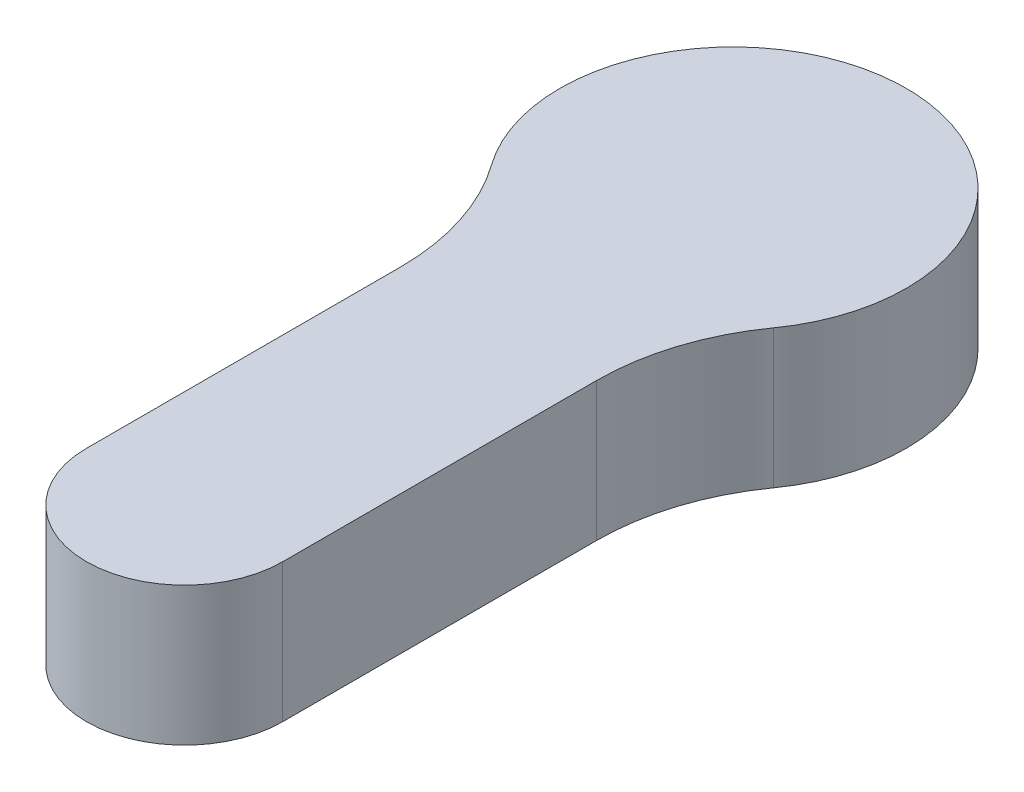
ISO-10303-21;
HEADER;
FILE_DESCRIPTION(('STEP AP214'),'2;1');
FILE_NAME('part.step','',(''),(''),'','','');
FILE_SCHEMA(('AUTOMOTIVE_DESIGN { 1 0 10303 214 1 1 1 1 }'));
ENDSEC;
DATA;
#1=APPLICATION_CONTEXT('core data for automotive mechanical design processes');
#2=APPLICATION_PROTOCOL_DEFINITION('international standard','automotive_design',2000,#1);
#3=PRODUCT_CONTEXT('',#1,'mechanical');
#4=PRODUCT('Part','Part','',(#3));
#5=PRODUCT_RELATED_PRODUCT_CATEGORY('part','',(#4));
#6=PRODUCT_DEFINITION_FORMATION('','',#4);
#7=PRODUCT_DEFINITION_CONTEXT('part definition',#1,'design');
#8=PRODUCT_DEFINITION('design','',#6,#7);
#9=PRODUCT_DEFINITION_SHAPE('','',#8);
#10=(LENGTH_UNIT() NAMED_UNIT(*) SI_UNIT(.MILLI.,.METRE.));
#11=(NAMED_UNIT(*) PLANE_ANGLE_UNIT() SI_UNIT($,.RADIAN.));
#12=(NAMED_UNIT(*) SI_UNIT($,.STERADIAN.) SOLID_ANGLE_UNIT());
#13=UNCERTAINTY_MEASURE_WITH_UNIT(LENGTH_MEASURE(1.E-05),#10,'distance_accuracy_value','');
#14=(GEOMETRIC_REPRESENTATION_CONTEXT(3) GLOBAL_UNCERTAINTY_ASSIGNED_CONTEXT((#13)) GLOBAL_UNIT_ASSIGNED_CONTEXT((#10,
#11,#12)) REPRESENTATION_CONTEXT('',''));
#15=CARTESIAN_POINT('',(0.,0.,0.));
#16=DIRECTION('',(0.,0.,1.));
#17=DIRECTION('',(1.,0.,0.));
#18=AXIS2_PLACEMENT_3D('',#15,#16,#17);
#19=CARTESIAN_POINT('',(0.,6.,0.));
#20=DIRECTION('',(0.,-1.,0.));
#21=DIRECTION('',(0.,0.,-1.));
#22=AXIS2_PLACEMENT_3D('',#19,#20,#21);
#23=CYLINDRICAL_SURFACE('',#22,7.5);
#24=CARTESIAN_POINT('',(0.,0.,0.));
#25=DIRECTION('',(0.,1.,0.));
#26=DIRECTION('',(0.,0.,1.));
#27=AXIS2_PLACEMENT_3D('',#24,#25,#26);
#28=CIRCLE('',#27,7.5);
#29=CARTESIAN_POINT('',(6.10714285714286,0.,4.35348206869501));
#30=VERTEX_POINT('',#29);
#31=CARTESIAN_POINT('',(-6.10714285714286,0.,4.35348206869501));
#32=VERTEX_POINT('',#31);
#33=EDGE_CURVE('E117',#30,#32,#28,.T.);
#34=ORIENTED_EDGE('',*,*,#33,.T.);
#35=DIRECTION('',(0.,-1.,0.));
#36=VECTOR('',#35,1.);
#37=CARTESIAN_POINT('',(-6.10714285714286,6.,4.35348206869501));
#38=LINE('',#37,#36);
#39=CARTESIAN_POINT('',(-6.10714285714286,6.,4.35348206869501));
#40=VERTEX_POINT('',#39);
#41=EDGE_CURVE('E130',#32,#40,#38,.F.);
#42=ORIENTED_EDGE('',*,*,#41,.T.);
#43=CARTESIAN_POINT('',(0.,6.,0.));
#44=DIRECTION('',(0.,1.,0.));
#45=DIRECTION('',(0.,0.,1.));
#46=AXIS2_PLACEMENT_3D('',#43,#44,#45);
#47=CIRCLE('',#46,7.5);
#48=CARTESIAN_POINT('',(6.10714285714286,6.,4.35348206869501));
#49=VERTEX_POINT('',#48);
#50=EDGE_CURVE('E97',#49,#40,#47,.T.);
#51=ORIENTED_EDGE('',*,*,#50,.F.);
#52=DIRECTION('',(0.,-1.,0.));
#53=VECTOR('',#52,1.);
#54=CARTESIAN_POINT('',(6.10714285714286,6.,4.35348206869501));
#55=LINE('',#54,#53);
#56=EDGE_CURVE('E127',#49,#30,#55,.T.);
#57=ORIENTED_EDGE('',*,*,#56,.T.);
#58=EDGE_LOOP('',(#34,#42,#51,#57));
#59=FACE_BOUND('',#58,.T.);
#60=ADVANCED_FACE('F34',(#59),#23,.T.);
#61=CARTESIAN_POINT('',(-4.25,6.,0.));
#62=DIRECTION('',(1.,0.,0.));
#63=DIRECTION('',(0.,0.,-1.));
#64=AXIS2_PLACEMENT_3D('',#61,#62,#63);
#65=PLANE('',#64);
#66=DIRECTION('',(0.,0.,1.));
#67=VECTOR('',#66,1.);
#68=CARTESIAN_POINT('',(-4.25,6.,0.));
#69=LINE('',#68,#67);
#70=CARTESIAN_POINT('',(-4.25,6.,10.158124826955));
#71=VERTEX_POINT('',#70);
#72=CARTESIAN_POINT('',(-4.25,6.,23.75));
#73=VERTEX_POINT('',#72);
#74=EDGE_CURVE('E85',#71,#73,#69,.T.);
#75=ORIENTED_EDGE('',*,*,#74,.F.);
#76=DIRECTION('',(0.,1.,0.));
#77=VECTOR('',#76,1.);
#78=CARTESIAN_POINT('',(-4.25,0.,10.158124826955));
#79=LINE('',#78,#77);
#80=CARTESIAN_POINT('',(-4.25,0.,10.158124826955));
#81=VERTEX_POINT('',#80);
#82=EDGE_CURVE('E107',#71,#81,#79,.F.);
#83=ORIENTED_EDGE('',*,*,#82,.T.);
#84=DIRECTION('',(0.,0.,1.));
#85=VECTOR('',#84,1.);
#86=CARTESIAN_POINT('',(-4.25,0.,0.));
#87=LINE('',#86,#85);
#88=CARTESIAN_POINT('',(-4.25,0.,23.75));
#89=VERTEX_POINT('',#88);
#90=EDGE_CURVE('E103',#81,#89,#87,.T.);
#91=ORIENTED_EDGE('',*,*,#90,.T.);
#92=DIRECTION('',(0.,-1.,0.));
#93=VECTOR('',#92,1.);
#94=CARTESIAN_POINT('',(-4.25,6.,23.75));
#95=LINE('',#94,#93);
#96=EDGE_CURVE('E100',#73,#89,#95,.T.);
#97=ORIENTED_EDGE('',*,*,#96,.F.);
#98=EDGE_LOOP('',(#75,#83,#91,#97));
#99=FACE_BOUND('',#98,.T.);
#100=ADVANCED_FACE('F101',(#99),#65,.F.);
#101=CARTESIAN_POINT('',(0.,6.,23.75));
#102=DIRECTION('',(0.,-1.,0.));
#103=DIRECTION('',(0.,0.,-1.));
#104=AXIS2_PLACEMENT_3D('',#101,#102,#103);
#105=CYLINDRICAL_SURFACE('',#104,4.25);
#106=CARTESIAN_POINT('',(0.,0.,23.75));
#107=DIRECTION('',(0.,1.,0.));
#108=DIRECTION('',(0.,0.,1.));
#109=AXIS2_PLACEMENT_3D('',#106,#107,#108);
#110=CIRCLE('',#109,4.25);
#111=CARTESIAN_POINT('',(4.25,0.,23.75));
#112=VERTEX_POINT('',#111);
#113=EDGE_CURVE('E121',#89,#112,#110,.T.);
#114=ORIENTED_EDGE('',*,*,#113,.T.);
#115=DIRECTION('',(0.,-1.,0.));
#116=VECTOR('',#115,1.);
#117=CARTESIAN_POINT('',(4.25,6.,23.75));
#118=LINE('',#117,#116);
#119=CARTESIAN_POINT('',(4.25,6.,23.75));
#120=VERTEX_POINT('',#119);
#121=EDGE_CURVE('E108',#120,#112,#118,.T.);
#122=ORIENTED_EDGE('',*,*,#121,.F.);
#123=CARTESIAN_POINT('',(0.,6.,23.75));
#124=DIRECTION('',(0.,1.,0.));
#125=DIRECTION('',(0.,0.,1.));
#126=AXIS2_PLACEMENT_3D('',#123,#124,#125);
#127=CIRCLE('',#126,4.25);
#128=EDGE_CURVE('E89',#73,#120,#127,.T.);
#129=ORIENTED_EDGE('',*,*,#128,.F.);
#130=ORIENTED_EDGE('',*,*,#96,.T.);
#131=EDGE_LOOP('',(#114,#122,#129,#130));
#132=FACE_BOUND('',#131,.T.);
#133=ADVANCED_FACE('F110',(#132),#105,.T.);
#134=CARTESIAN_POINT('',(4.25,6.,0.));
#135=DIRECTION('',(1.,0.,0.));
#136=DIRECTION('',(0.,0.,-1.));
#137=AXIS2_PLACEMENT_3D('',#134,#135,#136);
#138=PLANE('',#137);
#139=DIRECTION('',(0.,0.,1.));
#140=VECTOR('',#139,1.);
#141=CARTESIAN_POINT('',(4.25,0.,0.));
#142=LINE('',#141,#140);
#143=CARTESIAN_POINT('',(4.25,0.,10.158124826955));
#144=VERTEX_POINT('',#143);
#145=EDGE_CURVE('E123',#144,#112,#142,.T.);
#146=ORIENTED_EDGE('',*,*,#145,.F.);
#147=DIRECTION('',(0.,-1.,0.));
#148=VECTOR('',#147,1.);
#149=CARTESIAN_POINT('',(4.25,6.,10.158124826955));
#150=LINE('',#149,#148);
#151=CARTESIAN_POINT('',(4.25,6.,10.158124826955));
#152=VERTEX_POINT('',#151);
#153=EDGE_CURVE('E49',#144,#152,#150,.F.);
#154=ORIENTED_EDGE('',*,*,#153,.T.);
#155=DIRECTION('',(0.,0.,1.));
#156=VECTOR('',#155,1.);
#157=CARTESIAN_POINT('',(4.25,6.,0.));
#158=LINE('',#157,#156);
#159=EDGE_CURVE('E112',#152,#120,#158,.T.);
#160=ORIENTED_EDGE('',*,*,#159,.T.);
#161=ORIENTED_EDGE('',*,*,#121,.T.);
#162=EDGE_LOOP('',(#146,#154,#160,#161));
#163=FACE_BOUND('',#162,.T.);
#164=ADVANCED_FACE('F158',(#163),#138,.T.);
#165=CARTESIAN_POINT('',(0.,6.,0.));
#166=DIRECTION('',(0.,1.,0.));
#167=DIRECTION('',(0.,0.,1.));
#168=AXIS2_PLACEMENT_3D('',#165,#166,#167);
#169=PLANE('',#168);
#170=ORIENTED_EDGE('',*,*,#159,.F.);
#171=CARTESIAN_POINT('',(14.25,6.,10.158124826955));
#172=DIRECTION('',(0.,1.,0.));
#173=DIRECTION('',(0.,0.,1.));
#174=AXIS2_PLACEMENT_3D('',#171,#172,#173);
#175=CIRCLE('',#174,10.);
#176=EDGE_CURVE('E11',#152,#49,#175,.F.);
#177=ORIENTED_EDGE('',*,*,#176,.T.);
#178=ORIENTED_EDGE('',*,*,#50,.T.);
#179=CARTESIAN_POINT('',(-14.25,6.,10.158124826955));
#180=DIRECTION('',(0.,1.,0.));
#181=DIRECTION('',(0.,0.,1.));
#182=AXIS2_PLACEMENT_3D('',#179,#180,#181);
#183=CIRCLE('',#182,10.);
#184=EDGE_CURVE('E93',#40,#71,#183,.F.);
#185=ORIENTED_EDGE('',*,*,#184,.T.);
#186=ORIENTED_EDGE('',*,*,#74,.T.);
#187=ORIENTED_EDGE('',*,*,#128,.T.);
#188=EDGE_LOOP('',(#170,#177,#178,#185,#186,#187));
#189=FACE_BOUND('',#188,.T.);
#190=ADVANCED_FACE('F87',(#189),#169,.T.);
#191=CARTESIAN_POINT('',(0.,0.,0.));
#192=DIRECTION('',(0.,1.,0.));
#193=DIRECTION('',(0.,0.,1.));
#194=AXIS2_PLACEMENT_3D('',#191,#192,#193);
#195=PLANE('',#194);
#196=ORIENTED_EDGE('',*,*,#33,.F.);
#197=CARTESIAN_POINT('',(14.25,0.,10.158124826955));
#198=DIRECTION('',(0.,1.,0.));
#199=DIRECTION('',(0.,0.,1.));
#200=AXIS2_PLACEMENT_3D('',#197,#198,#199);
#201=CIRCLE('',#200,10.);
#202=EDGE_CURVE('E42',#30,#144,#201,.T.);
#203=ORIENTED_EDGE('',*,*,#202,.T.);
#204=ORIENTED_EDGE('',*,*,#145,.T.);
#205=ORIENTED_EDGE('',*,*,#113,.F.);
#206=ORIENTED_EDGE('',*,*,#90,.F.);
#207=CARTESIAN_POINT('',(-14.25,0.,10.158124826955));
#208=DIRECTION('',(0.,1.,0.));
#209=DIRECTION('',(0.,0.,1.));
#210=AXIS2_PLACEMENT_3D('',#207,#208,#209);
#211=CIRCLE('',#210,10.);
#212=EDGE_CURVE('E133',#81,#32,#211,.T.);
#213=ORIENTED_EDGE('',*,*,#212,.T.);
#214=EDGE_LOOP('',(#196,#203,#204,#205,#206,#213));
#215=FACE_BOUND('',#214,.T.);
#216=ADVANCED_FACE('F135',(#215),#195,.F.);
#217=CARTESIAN_POINT('',(-14.25,6.,10.158124826955));
#218=DIRECTION('',(0.,-1.,0.));
#219=DIRECTION('',(0.,0.,-1.));
#220=AXIS2_PLACEMENT_3D('',#217,#218,#219);
#221=CYLINDRICAL_SURFACE('',#220,10.);
#222=ORIENTED_EDGE('',*,*,#184,.F.);
#223=ORIENTED_EDGE('',*,*,#41,.F.);
#224=ORIENTED_EDGE('',*,*,#212,.F.);
#225=ORIENTED_EDGE('',*,*,#82,.F.);
#226=EDGE_LOOP('',(#222,#223,#224,#225));
#227=FACE_BOUND('',#226,.T.);
#228=ADVANCED_FACE('F141',(#227),#221,.F.);
#229=CARTESIAN_POINT('',(14.25,6.,10.158124826955));
#230=DIRECTION('',(0.,-1.,0.));
#231=DIRECTION('',(0.,0.,-1.));
#232=AXIS2_PLACEMENT_3D('',#229,#230,#231);
#233=CYLINDRICAL_SURFACE('',#232,10.);
#234=ORIENTED_EDGE('',*,*,#176,.F.);
#235=ORIENTED_EDGE('',*,*,#153,.F.);
#236=ORIENTED_EDGE('',*,*,#202,.F.);
#237=ORIENTED_EDGE('',*,*,#56,.F.);
#238=EDGE_LOOP('',(#234,#235,#236,#237));
#239=FACE_BOUND('',#238,.T.);
#240=ADVANCED_FACE('F36',(#239),#233,.F.);
#241=CLOSED_SHELL('',(#60,#100,#133,#164,#190,#216,#228,#240));
#242=MANIFOLD_SOLID_BREP('B2',#241);
#243=ADVANCED_BREP_SHAPE_REPRESENTATION('',(#18,#242),#14);
#244=SHAPE_DEFINITION_REPRESENTATION(#9,#243);
ENDSEC;
END-ISO-10303-21;
